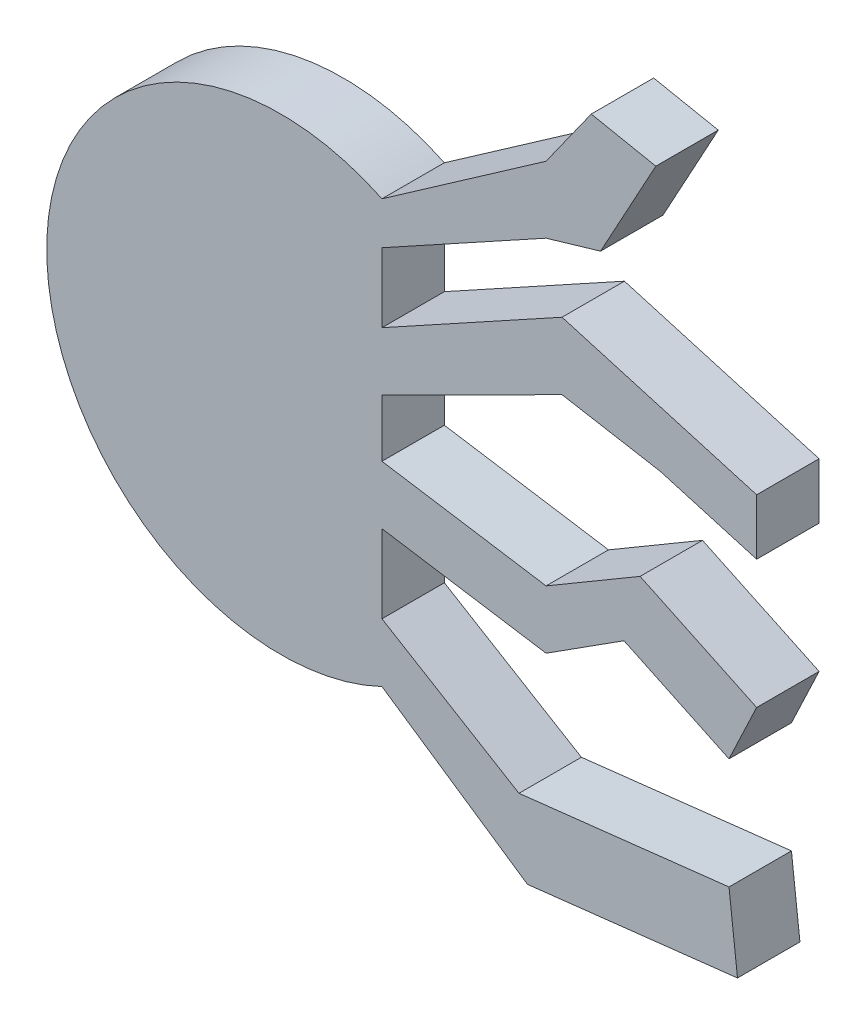
ISO-10303-21;
HEADER;
FILE_DESCRIPTION(('STEP AP214'),'2;1');
FILE_NAME('part.step','',(''),(''),'','','');
FILE_SCHEMA(('AUTOMOTIVE_DESIGN { 1 0 10303 214 1 1 1 1 }'));
ENDSEC;
DATA;
#1=APPLICATION_CONTEXT('core data for automotive mechanical design processes');
#2=APPLICATION_PROTOCOL_DEFINITION('international standard','automotive_design',2000,#1);
#3=PRODUCT_CONTEXT('',#1,'mechanical');
#4=PRODUCT('Part','Part','',(#3));
#5=PRODUCT_RELATED_PRODUCT_CATEGORY('part','',(#4));
#6=PRODUCT_DEFINITION_FORMATION('','',#4);
#7=PRODUCT_DEFINITION_CONTEXT('part definition',#1,'design');
#8=PRODUCT_DEFINITION('design','',#6,#7);
#9=PRODUCT_DEFINITION_SHAPE('','',#8);
#10=(LENGTH_UNIT() NAMED_UNIT(*) SI_UNIT(.MILLI.,.METRE.));
#11=(NAMED_UNIT(*) PLANE_ANGLE_UNIT() SI_UNIT($,.RADIAN.));
#12=(NAMED_UNIT(*) SI_UNIT($,.STERADIAN.) SOLID_ANGLE_UNIT());
#13=UNCERTAINTY_MEASURE_WITH_UNIT(LENGTH_MEASURE(1.E-05),#10,'distance_accuracy_value','');
#14=(GEOMETRIC_REPRESENTATION_CONTEXT(3) GLOBAL_UNCERTAINTY_ASSIGNED_CONTEXT((#13)) GLOBAL_UNIT_ASSIGNED_CONTEXT((#10,
#11,#12)) REPRESENTATION_CONTEXT('',''));
#15=CARTESIAN_POINT('',(0.,0.,0.));
#16=DIRECTION('',(0.,0.,1.));
#17=DIRECTION('',(1.,0.,0.));
#18=AXIS2_PLACEMENT_3D('',#15,#16,#17);
#19=CARTESIAN_POINT('',(0.,0.,6.));
#20=DIRECTION('',(0.,0.,-1.));
#21=DIRECTION('',(-1.,0.,0.));
#22=AXIS2_PLACEMENT_3D('',#19,#20,#21);
#23=CYLINDRICAL_SURFACE('',#22,22.5);
#24=CARTESIAN_POINT('',(0.,0.,0.));
#25=DIRECTION('',(0.,0.,1.));
#26=DIRECTION('',(1.,0.,0.));
#27=AXIS2_PLACEMENT_3D('',#24,#25,#26);
#28=CIRCLE('',#27,22.5);
#29=CARTESIAN_POINT('',(9.71323873703334,20.2953933994243,0.));
#30=VERTEX_POINT('',#29);
#31=CARTESIAN_POINT('',(9.71323873703334,-20.2953933994243,0.));
#32=VERTEX_POINT('',#31);
#33=EDGE_CURVE('E257',#30,#32,#28,.T.);
#34=ORIENTED_EDGE('',*,*,#33,.T.);
#35=DIRECTION('',(0.,0.,-1.));
#36=VECTOR('',#35,1.);
#37=CARTESIAN_POINT('',(9.71323873703334,-20.2953933994243,6.));
#38=LINE('',#37,#36);
#39=CARTESIAN_POINT('',(9.71323873703334,-20.2953933994243,6.));
#40=VERTEX_POINT('',#39);
#41=EDGE_CURVE('E11',#40,#32,#38,.T.);
#42=ORIENTED_EDGE('',*,*,#41,.F.);
#43=CARTESIAN_POINT('',(0.,0.,6.));
#44=DIRECTION('',(0.,0.,1.));
#45=DIRECTION('',(1.,0.,0.));
#46=AXIS2_PLACEMENT_3D('',#43,#44,#45);
#47=CIRCLE('',#46,22.5);
#48=CARTESIAN_POINT('',(9.71323873703334,20.2953933994243,6.));
#49=VERTEX_POINT('',#48);
#50=EDGE_CURVE('E312',#49,#40,#47,.T.);
#51=ORIENTED_EDGE('',*,*,#50,.F.);
#52=DIRECTION('',(0.,0.,-1.));
#53=VECTOR('',#52,1.);
#54=CARTESIAN_POINT('',(9.71323873703334,20.2953933994243,6.));
#55=LINE('',#54,#53);
#56=EDGE_CURVE('E253',#49,#30,#55,.T.);
#57=ORIENTED_EDGE('',*,*,#56,.T.);
#58=EDGE_LOOP('',(#34,#42,#51,#57));
#59=FACE_BOUND('',#58,.T.);
#60=ADVANCED_FACE('F41',(#59),#23,.T.);
#61=CARTESIAN_POINT('',(9.71323873703334,-20.2953933994243,6.));
#62=DIRECTION('',(0.560706931443563,0.828014333831935,0.));
#63=DIRECTION('',(-0.828014333831935,0.560706931443563,0.));
#64=AXIS2_PLACEMENT_3D('',#61,#62,#63);
#65=PLANE('',#64);
#66=DIRECTION('',(0.828014333831935,-0.560706931443563,0.));
#67=VECTOR('',#66,1.);
#68=CARTESIAN_POINT('',(9.71323873703334,-20.2953933994243,0.));
#69=LINE('',#68,#67);
#70=CARTESIAN_POINT('',(23.6966889023651,-29.7645742008144,0.));
#71=VERTEX_POINT('',#70);
#72=EDGE_CURVE('E260',#32,#71,#69,.T.);
#73=ORIENTED_EDGE('',*,*,#72,.T.);
#74=DIRECTION('',(0.,0.,-1.));
#75=VECTOR('',#74,1.);
#76=CARTESIAN_POINT('',(23.6966889023651,-29.7645742008144,6.));
#77=LINE('',#76,#75);
#78=CARTESIAN_POINT('',(23.6966889023651,-29.7645742008144,6.));
#79=VERTEX_POINT('',#78);
#80=EDGE_CURVE('E49',#79,#71,#77,.T.);
#81=ORIENTED_EDGE('',*,*,#80,.F.);
#82=DIRECTION('',(0.828014333831935,-0.560706931443563,0.));
#83=VECTOR('',#82,1.);
#84=CARTESIAN_POINT('',(9.71323873703334,-20.2953933994243,6.));
#85=LINE('',#84,#83);
#86=EDGE_CURVE('E160',#40,#79,#85,.T.);
#87=ORIENTED_EDGE('',*,*,#86,.F.);
#88=ORIENTED_EDGE('',*,*,#41,.T.);
#89=EDGE_LOOP('',(#73,#81,#87,#88));
#90=FACE_BOUND('',#89,.T.);
#91=ADVANCED_FACE('F470',(#90),#65,.F.);
#92=CARTESIAN_POINT('',(23.6966889023651,-29.7645742008144,6.));
#93=DIRECTION('',(-0.113191877530502,0.993573147212182,0.));
#94=DIRECTION('',(-0.993573147212182,-0.113191877530502,0.));
#95=AXIS2_PLACEMENT_3D('',#92,#93,#94);
#96=PLANE('',#95);
#97=DIRECTION('',(0.993573147212182,0.113191877530502,0.));
#98=VECTOR('',#97,1.);
#99=CARTESIAN_POINT('',(23.6966889023651,-29.7645742008144,0.));
#100=LINE('',#99,#98);
#101=CARTESIAN_POINT('',(43.8803915793121,-27.4651650350862,0.));
#102=VERTEX_POINT('',#101);
#103=EDGE_CURVE('E263',#71,#102,#100,.T.);
#104=ORIENTED_EDGE('',*,*,#103,.T.);
#105=DIRECTION('',(0.,0.,-1.));
#106=VECTOR('',#105,1.);
#107=CARTESIAN_POINT('',(43.8803915793121,-27.4651650350862,6.));
#108=LINE('',#107,#106);
#109=CARTESIAN_POINT('',(43.8803915793121,-27.4651650350862,6.));
#110=VERTEX_POINT('',#109);
#111=EDGE_CURVE('E379',#110,#102,#108,.T.);
#112=ORIENTED_EDGE('',*,*,#111,.F.);
#113=DIRECTION('',(0.993573147212182,0.113191877530502,0.));
#114=VECTOR('',#113,1.);
#115=CARTESIAN_POINT('',(23.6966889023651,-29.7645742008144,6.));
#116=LINE('',#115,#114);
#117=EDGE_CURVE('E387',#79,#110,#116,.T.);
#118=ORIENTED_EDGE('',*,*,#117,.F.);
#119=ORIENTED_EDGE('',*,*,#80,.T.);
#120=EDGE_LOOP('',(#104,#112,#118,#119));
#121=FACE_BOUND('',#120,.T.);
#122=ADVANCED_FACE('F385',(#121),#96,.F.);
#123=CARTESIAN_POINT('',(43.8803915793121,-27.4651650350862,6.));
#124=DIRECTION('',(-0.993573147212182,-0.113191877530502,0.));
#125=DIRECTION('',(0.113191877530502,-0.993573147212182,0.));
#126=AXIS2_PLACEMENT_3D('',#123,#124,#125);
#127=PLANE('',#126);
#128=DIRECTION('',(-0.113191877530501,0.993573147212182,0.));
#129=VECTOR('',#128,1.);
#130=CARTESIAN_POINT('',(43.8803915793121,-27.4651650350862,0.));
#131=LINE('',#130,#129);
#132=CARTESIAN_POINT('',(43.0635821524646,-20.2953933994243,0.));
#133=VERTEX_POINT('',#132);
#134=EDGE_CURVE('E265',#102,#133,#131,.T.);
#135=ORIENTED_EDGE('',*,*,#134,.T.);
#136=DIRECTION('',(0.,0.,-1.));
#137=VECTOR('',#136,1.);
#138=CARTESIAN_POINT('',(43.0635821524646,-20.2953933994243,6.));
#139=LINE('',#138,#137);
#140=CARTESIAN_POINT('',(43.0635821524646,-20.2953933994243,6.));
#141=VERTEX_POINT('',#140);
#142=EDGE_CURVE('E376',#141,#133,#139,.T.);
#143=ORIENTED_EDGE('',*,*,#142,.F.);
#144=DIRECTION('',(-0.113191877530501,0.993573147212182,0.));
#145=VECTOR('',#144,1.);
#146=CARTESIAN_POINT('',(43.8803915793121,-27.4651650350862,6.));
#147=LINE('',#146,#145);
#148=EDGE_CURVE('E405',#110,#141,#147,.T.);
#149=ORIENTED_EDGE('',*,*,#148,.F.);
#150=ORIENTED_EDGE('',*,*,#111,.T.);
#151=EDGE_LOOP('',(#135,#143,#149,#150));
#152=FACE_BOUND('',#151,.T.);
#153=ADVANCED_FACE('F396',(#152),#127,.F.);
#154=CARTESIAN_POINT('',(43.0635821524646,-20.2953933994243,6.));
#155=DIRECTION('',(0.113191877530502,-0.993573147212182,0.));
#156=DIRECTION('',(0.993573147212182,0.113191877530502,0.));
#157=AXIS2_PLACEMENT_3D('',#154,#155,#156);
#158=PLANE('',#157);
#159=DIRECTION('',(-0.993573147212182,-0.113191877530502,0.));
#160=VECTOR('',#159,1.);
#161=CARTESIAN_POINT('',(43.0635821524646,-20.2953933994243,0.));
#162=LINE('',#161,#160);
#163=CARTESIAN_POINT('',(22.8798794755175,-22.5948025651524,0.));
#164=VERTEX_POINT('',#163);
#165=EDGE_CURVE('E267',#133,#164,#162,.T.);
#166=ORIENTED_EDGE('',*,*,#165,.T.);
#167=DIRECTION('',(0.,0.,-1.));
#168=VECTOR('',#167,1.);
#169=CARTESIAN_POINT('',(22.8798794755175,-22.5948025651524,6.));
#170=LINE('',#169,#168);
#171=CARTESIAN_POINT('',(22.8798794755175,-22.5948025651524,6.));
#172=VERTEX_POINT('',#171);
#173=EDGE_CURVE('E373',#172,#164,#170,.T.);
#174=ORIENTED_EDGE('',*,*,#173,.F.);
#175=DIRECTION('',(-0.993573147212182,-0.113191877530502,0.));
#176=VECTOR('',#175,1.);
#177=CARTESIAN_POINT('',(43.0635821524646,-20.2953933994243,6.));
#178=LINE('',#177,#176);
#179=EDGE_CURVE('E402',#141,#172,#178,.T.);
#180=ORIENTED_EDGE('',*,*,#179,.F.);
#181=ORIENTED_EDGE('',*,*,#142,.T.);
#182=EDGE_LOOP('',(#166,#174,#180,#181));
#183=FACE_BOUND('',#182,.T.);
#184=ADVANCED_FACE('F400',(#183),#158,.F.);
#185=CARTESIAN_POINT('',(22.8798794755175,-22.5948025651524,6.));
#186=DIRECTION('',(-0.516335030808371,-0.856386674324232,0.));
#187=DIRECTION('',(0.856386674324232,-0.516335030808371,0.));
#188=AXIS2_PLACEMENT_3D('',#185,#186,#187);
#189=PLANE('',#188);
#190=DIRECTION('',(-0.856386674324232,0.516335030808371,0.));
#191=VECTOR('',#190,1.);
#192=CARTESIAN_POINT('',(22.8798794755175,-22.5948025651524,0.));
#193=LINE('',#192,#191);
#194=CARTESIAN_POINT('',(9.71323873703334,-14.6563349836566,0.));
#195=VERTEX_POINT('',#194);
#196=EDGE_CURVE('E269',#164,#195,#193,.T.);
#197=ORIENTED_EDGE('',*,*,#196,.T.);
#198=DIRECTION('',(0.,0.,-1.));
#199=VECTOR('',#198,1.);
#200=CARTESIAN_POINT('',(9.71323873703334,-14.6563349836566,6.));
#201=LINE('',#200,#199);
#202=CARTESIAN_POINT('',(9.71323873703334,-14.6563349836566,6.));
#203=VERTEX_POINT('',#202);
#204=EDGE_CURVE('E370',#203,#195,#201,.T.);
#205=ORIENTED_EDGE('',*,*,#204,.F.);
#206=DIRECTION('',(-0.856386674324232,0.516335030808371,0.));
#207=VECTOR('',#206,1.);
#208=CARTESIAN_POINT('',(22.8798794755175,-22.5948025651524,6.));
#209=LINE('',#208,#207);
#210=EDGE_CURVE('E404',#172,#203,#209,.T.);
#211=ORIENTED_EDGE('',*,*,#210,.F.);
#212=ORIENTED_EDGE('',*,*,#173,.T.);
#213=EDGE_LOOP('',(#197,#205,#211,#212));
#214=FACE_BOUND('',#213,.T.);
#215=ADVANCED_FACE('F483',(#214),#189,.F.);
#216=CARTESIAN_POINT('',(9.71323873703334,-7.15371740448759,6.));
#217=DIRECTION('',(-1.,0.,0.));
#218=DIRECTION('',(0.,0.,1.));
#219=AXIS2_PLACEMENT_3D('',#216,#217,#218);
#220=PLANE('',#219);
#221=DIRECTION('',(0.,1.,0.));
#222=VECTOR('',#221,1.);
#223=CARTESIAN_POINT('',(9.71323873703334,-7.15371740448759,0.));
#224=LINE('',#223,#222);
#225=CARTESIAN_POINT('',(9.71323873703334,-7.15371740448759,0.));
#226=VERTEX_POINT('',#225);
#227=EDGE_CURVE('E271',#195,#226,#224,.T.);
#228=ORIENTED_EDGE('',*,*,#227,.T.);
#229=DIRECTION('',(0.,0.,-1.));
#230=VECTOR('',#229,1.);
#231=CARTESIAN_POINT('',(9.71323873703334,-7.15371740448759,6.));
#232=LINE('',#231,#230);
#233=CARTESIAN_POINT('',(9.71323873703334,-7.15371740448759,6.));
#234=VERTEX_POINT('',#233);
#235=EDGE_CURVE('E367',#234,#226,#232,.T.);
#236=ORIENTED_EDGE('',*,*,#235,.F.);
#237=DIRECTION('',(0.,1.,0.));
#238=VECTOR('',#237,1.);
#239=CARTESIAN_POINT('',(9.71323873703334,-7.15371740448759,6.));
#240=LINE('',#239,#238);
#241=EDGE_CURVE('E407',#203,#234,#240,.T.);
#242=ORIENTED_EDGE('',*,*,#241,.F.);
#243=ORIENTED_EDGE('',*,*,#204,.T.);
#244=EDGE_LOOP('',(#228,#236,#242,#243));
#245=FACE_BOUND('',#244,.T.);
#246=ADVANCED_FACE('F486',(#245),#220,.F.);
#247=CARTESIAN_POINT('',(9.71323873703334,-7.15371740448759,6.));
#248=DIRECTION('',(0.15556619244721,0.987825470296994,0.));
#249=DIRECTION('',(-0.987825470296994,0.15556619244721,0.));
#250=AXIS2_PLACEMENT_3D('',#247,#248,#249);
#251=PLANE('',#250);
#252=DIRECTION('',(0.987825470296994,-0.15556619244721,0.));
#253=VECTOR('',#252,1.);
#254=CARTESIAN_POINT('',(9.71323873703334,-7.15371740448759,0.));
#255=LINE('',#254,#253);
#256=CARTESIAN_POINT('',(25.485118253487,-9.63752787292303,0.));
#257=VERTEX_POINT('',#256);
#258=EDGE_CURVE('E273',#226,#257,#255,.T.);
#259=ORIENTED_EDGE('',*,*,#258,.T.);
#260=DIRECTION('',(0.,0.,-1.));
#261=VECTOR('',#260,1.);
#262=CARTESIAN_POINT('',(25.485118253487,-9.63752787292303,6.));
#263=LINE('',#262,#261);
#264=CARTESIAN_POINT('',(25.485118253487,-9.63752787292303,6.));
#265=VERTEX_POINT('',#264);
#266=EDGE_CURVE('E364',#265,#257,#263,.T.);
#267=ORIENTED_EDGE('',*,*,#266,.F.);
#268=DIRECTION('',(0.987825470296994,-0.15556619244721,0.));
#269=VECTOR('',#268,1.);
#270=CARTESIAN_POINT('',(9.71323873703334,-7.15371740448759,6.));
#271=LINE('',#270,#269);
#272=EDGE_CURVE('E413',#234,#265,#271,.T.);
#273=ORIENTED_EDGE('',*,*,#272,.F.);
#274=ORIENTED_EDGE('',*,*,#235,.T.);
#275=EDGE_LOOP('',(#259,#267,#273,#274));
#276=FACE_BOUND('',#275,.T.);
#277=ADVANCED_FACE('F490',(#276),#251,.F.);
#278=CARTESIAN_POINT('',(25.485118253487,-9.63752787292303,6.));
#279=DIRECTION('',(-0.538397754255914,0.84269084379278,0.));
#280=DIRECTION('',(-0.842690843792781,-0.538397754255914,0.));
#281=AXIS2_PLACEMENT_3D('',#278,#279,#280);
#282=PLANE('',#281);
#283=DIRECTION('',(0.84269084379278,0.538397754255914,0.));
#284=VECTOR('',#283,1.);
#285=CARTESIAN_POINT('',(25.485118253487,-9.63752787292303,0.));
#286=LINE('',#285,#284);
#287=CARTESIAN_POINT('',(32.971730813991,-4.85430823875943,0.));
#288=VERTEX_POINT('',#287);
#289=EDGE_CURVE('E275',#257,#288,#286,.T.);
#290=ORIENTED_EDGE('',*,*,#289,.T.);
#291=DIRECTION('',(0.,0.,-1.));
#292=VECTOR('',#291,1.);
#293=CARTESIAN_POINT('',(32.971730813991,-4.85430823875943,6.));
#294=LINE('',#293,#292);
#295=CARTESIAN_POINT('',(32.971730813991,-4.85430823875943,6.));
#296=VERTEX_POINT('',#295);
#297=EDGE_CURVE('E361',#296,#288,#294,.T.);
#298=ORIENTED_EDGE('',*,*,#297,.F.);
#299=DIRECTION('',(0.84269084379278,0.538397754255914,0.));
#300=VECTOR('',#299,1.);
#301=CARTESIAN_POINT('',(25.485118253487,-9.63752787292303,6.));
#302=LINE('',#301,#300);
#303=EDGE_CURVE('E415',#265,#296,#302,.T.);
#304=ORIENTED_EDGE('',*,*,#303,.F.);
#305=ORIENTED_EDGE('',*,*,#266,.T.);
#306=EDGE_LOOP('',(#290,#298,#304,#305));
#307=FACE_BOUND('',#306,.T.);
#308=ADVANCED_FACE('F494',(#307),#282,.F.);
#309=CARTESIAN_POINT('',(32.971730813991,-4.85430823875943,6.));
#310=DIRECTION('',(0.428296149562964,0.903638427840217,0.));
#311=DIRECTION('',(-0.903638427840217,0.428296149562964,0.));
#312=AXIS2_PLACEMENT_3D('',#309,#310,#311);
#313=PLANE('',#312);
#314=DIRECTION('',(0.903638427840217,-0.428296149562963,0.));
#315=VECTOR('',#314,1.);
#316=CARTESIAN_POINT('',(32.971730813991,-4.85430823875943,0.));
#317=LINE('',#316,#315);
#318=CARTESIAN_POINT('',(43.0635821524646,-9.63752787292303,0.));
#319=VERTEX_POINT('',#318);
#320=EDGE_CURVE('E277',#288,#319,#317,.T.);
#321=ORIENTED_EDGE('',*,*,#320,.T.);
#322=DIRECTION('',(0.,0.,-1.));
#323=VECTOR('',#322,1.);
#324=CARTESIAN_POINT('',(43.0635821524646,-9.63752787292303,6.));
#325=LINE('',#324,#323);
#326=CARTESIAN_POINT('',(43.0635821524646,-9.63752787292303,6.));
#327=VERTEX_POINT('',#326);
#328=EDGE_CURVE('E358',#327,#319,#325,.T.);
#329=ORIENTED_EDGE('',*,*,#328,.F.);
#330=DIRECTION('',(0.903638427840217,-0.428296149562963,0.));
#331=VECTOR('',#330,1.);
#332=CARTESIAN_POINT('',(32.971730813991,-4.85430823875943,6.));
#333=LINE('',#332,#331);
#334=EDGE_CURVE('E417',#296,#327,#333,.T.);
#335=ORIENTED_EDGE('',*,*,#334,.F.);
#336=ORIENTED_EDGE('',*,*,#297,.T.);
#337=EDGE_LOOP('',(#321,#329,#335,#336));
#338=FACE_BOUND('',#337,.T.);
#339=ADVANCED_FACE('F498',(#338),#313,.F.);
#340=CARTESIAN_POINT('',(43.0635821524646,-9.63752787292303,6.));
#341=DIRECTION('',(-0.903638427840217,0.428296149562964,0.));
#342=DIRECTION('',(-0.428296149562964,-0.903638427840217,0.));
#343=AXIS2_PLACEMENT_3D('',#340,#341,#342);
#344=PLANE('',#343);
#345=DIRECTION('',(0.428296149562964,0.903638427840217,0.));
#346=VECTOR('',#345,1.);
#347=CARTESIAN_POINT('',(43.0635821524646,-9.63752787292303,0.));
#348=LINE('',#347,#346);
#349=CARTESIAN_POINT('',(45.7205039064935,-4.03183517838196,0.));
#350=VERTEX_POINT('',#349);
#351=EDGE_CURVE('E279',#319,#350,#348,.T.);
#352=ORIENTED_EDGE('',*,*,#351,.T.);
#353=DIRECTION('',(0.,0.,-1.));
#354=VECTOR('',#353,1.);
#355=CARTESIAN_POINT('',(45.7205039064935,-4.03183517838196,6.));
#356=LINE('',#355,#354);
#357=CARTESIAN_POINT('',(45.7205039064935,-4.03183517838196,6.));
#358=VERTEX_POINT('',#357);
#359=EDGE_CURVE('E355',#358,#350,#356,.T.);
#360=ORIENTED_EDGE('',*,*,#359,.F.);
#361=DIRECTION('',(0.428296149562964,0.903638427840217,0.));
#362=VECTOR('',#361,1.);
#363=CARTESIAN_POINT('',(43.0635821524646,-9.63752787292303,6.));
#364=LINE('',#363,#362);
#365=EDGE_CURVE('E419',#327,#358,#364,.T.);
#366=ORIENTED_EDGE('',*,*,#365,.F.);
#367=ORIENTED_EDGE('',*,*,#328,.T.);
#368=EDGE_LOOP('',(#352,#360,#366,#367));
#369=FACE_BOUND('',#368,.T.);
#370=ADVANCED_FACE('F502',(#369),#344,.F.);
#371=CARTESIAN_POINT('',(45.7205039064935,-4.03183517838196,6.));
#372=DIRECTION('',(-0.428296149562964,-0.903638427840217,0.));
#373=DIRECTION('',(0.903638427840217,-0.428296149562964,0.));
#374=AXIS2_PLACEMENT_3D('',#371,#372,#373);
#375=PLANE('',#374);
#376=DIRECTION('',(-0.903638427840217,0.428296149562964,0.));
#377=VECTOR('',#376,1.);
#378=CARTESIAN_POINT('',(45.7205039064935,-4.03183517838196,0.));
#379=LINE('',#378,#377);
#380=CARTESIAN_POINT('',(34.5193775826407,1.27714585592482,0.));
#381=VERTEX_POINT('',#380);
#382=EDGE_CURVE('E281',#350,#381,#379,.T.);
#383=ORIENTED_EDGE('',*,*,#382,.T.);
#384=DIRECTION('',(0.,0.,-1.));
#385=VECTOR('',#384,1.);
#386=CARTESIAN_POINT('',(34.5193775826407,1.27714585592482,6.));
#387=LINE('',#386,#385);
#388=CARTESIAN_POINT('',(34.5193775826407,1.27714585592482,6.));
#389=VERTEX_POINT('',#388);
#390=EDGE_CURVE('E352',#389,#381,#387,.T.);
#391=ORIENTED_EDGE('',*,*,#390,.F.);
#392=DIRECTION('',(-0.903638427840217,0.428296149562964,0.));
#393=VECTOR('',#392,1.);
#394=CARTESIAN_POINT('',(45.7205039064935,-4.03183517838196,6.));
#395=LINE('',#394,#393);
#396=EDGE_CURVE('E421',#358,#389,#395,.T.);
#397=ORIENTED_EDGE('',*,*,#396,.F.);
#398=ORIENTED_EDGE('',*,*,#359,.T.);
#399=EDGE_LOOP('',(#383,#391,#397,#398));
#400=FACE_BOUND('',#399,.T.);
#401=ADVANCED_FACE('F506',(#400),#375,.F.);
#402=CARTESIAN_POINT('',(34.5193775826407,1.27714585592482,6.));
#403=DIRECTION('',(0.506645081791365,-0.862154719929446,0.));
#404=DIRECTION('',(0.862154719929446,0.506645081791365,0.));
#405=AXIS2_PLACEMENT_3D('',#402,#403,#404);
#406=PLANE('',#405);
#407=DIRECTION('',(-0.862154719929446,-0.506645081791365,0.));
#408=VECTOR('',#407,1.);
#409=CARTESIAN_POINT('',(34.5193775826407,1.27714585592482,0.));
#410=LINE('',#409,#408);
#411=CARTESIAN_POINT('',(25.485118253487,-4.03183517838196,0.));
#412=VERTEX_POINT('',#411);
#413=EDGE_CURVE('E283',#381,#412,#410,.T.);
#414=ORIENTED_EDGE('',*,*,#413,.T.);
#415=DIRECTION('',(0.,0.,-1.));
#416=VECTOR('',#415,1.);
#417=CARTESIAN_POINT('',(25.485118253487,-4.03183517838196,6.));
#418=LINE('',#417,#416);
#419=CARTESIAN_POINT('',(25.485118253487,-4.03183517838196,6.));
#420=VERTEX_POINT('',#419);
#421=EDGE_CURVE('E349',#420,#412,#418,.T.);
#422=ORIENTED_EDGE('',*,*,#421,.F.);
#423=DIRECTION('',(-0.862154719929446,-0.506645081791365,0.));
#424=VECTOR('',#423,1.);
#425=CARTESIAN_POINT('',(34.5193775826407,1.27714585592482,6.));
#426=LINE('',#425,#424);
#427=EDGE_CURVE('E423',#389,#420,#426,.T.);
#428=ORIENTED_EDGE('',*,*,#427,.F.);
#429=ORIENTED_EDGE('',*,*,#390,.T.);
#430=EDGE_LOOP('',(#414,#422,#428,#429));
#431=FACE_BOUND('',#430,.T.);
#432=ADVANCED_FACE('F510',(#431),#406,.F.);
#433=CARTESIAN_POINT('',(25.485118253487,-4.03183517838196,6.));
#434=DIRECTION('',(-0.15556619244721,-0.987825470296994,0.));
#435=DIRECTION('',(0.987825470296994,-0.15556619244721,0.));
#436=AXIS2_PLACEMENT_3D('',#433,#434,#435);
#437=PLANE('',#436);
#438=DIRECTION('',(-0.987825470296994,0.15556619244721,0.));
#439=VECTOR('',#438,1.);
#440=CARTESIAN_POINT('',(25.485118253487,-4.03183517838196,0.));
#441=LINE('',#440,#439);
#442=CARTESIAN_POINT('',(9.71323873703334,-1.54802470994652,0.));
#443=VERTEX_POINT('',#442);
#444=EDGE_CURVE('E285',#412,#443,#441,.T.);
#445=ORIENTED_EDGE('',*,*,#444,.T.);
#446=DIRECTION('',(0.,0.,-1.));
#447=VECTOR('',#446,1.);
#448=CARTESIAN_POINT('',(9.71323873703334,-1.54802470994652,6.));
#449=LINE('',#448,#447);
#450=CARTESIAN_POINT('',(9.71323873703334,-1.54802470994652,6.));
#451=VERTEX_POINT('',#450);
#452=EDGE_CURVE('E346',#451,#443,#449,.T.);
#453=ORIENTED_EDGE('',*,*,#452,.F.);
#454=DIRECTION('',(-0.987825470296994,0.15556619244721,0.));
#455=VECTOR('',#454,1.);
#456=CARTESIAN_POINT('',(25.485118253487,-4.03183517838196,6.));
#457=LINE('',#456,#455);
#458=EDGE_CURVE('E425',#420,#451,#457,.T.);
#459=ORIENTED_EDGE('',*,*,#458,.F.);
#460=ORIENTED_EDGE('',*,*,#421,.T.);
#461=EDGE_LOOP('',(#445,#453,#459,#460));
#462=FACE_BOUND('',#461,.T.);
#463=ADVANCED_FACE('F514',(#462),#437,.F.);
#464=CARTESIAN_POINT('',(9.71323873703334,3.96009356319846,6.));
#465=DIRECTION('',(-1.,0.,0.));
#466=DIRECTION('',(0.,0.,1.));
#467=AXIS2_PLACEMENT_3D('',#464,#465,#466);
#468=PLANE('',#467);
#469=DIRECTION('',(0.,1.,0.));
#470=VECTOR('',#469,1.);
#471=CARTESIAN_POINT('',(9.71323873703334,3.96009356319846,0.));
#472=LINE('',#471,#470);
#473=CARTESIAN_POINT('',(9.71323873703334,3.96009356319846,0.));
#474=VERTEX_POINT('',#473);
#475=EDGE_CURVE('E287',#443,#474,#472,.T.);
#476=ORIENTED_EDGE('',*,*,#475,.T.);
#477=DIRECTION('',(0.,0.,-1.));
#478=VECTOR('',#477,1.);
#479=CARTESIAN_POINT('',(9.71323873703334,3.96009356319846,6.));
#480=LINE('',#479,#478);
#481=CARTESIAN_POINT('',(9.71323873703334,3.96009356319846,6.));
#482=VERTEX_POINT('',#481);
#483=EDGE_CURVE('E343',#482,#474,#480,.T.);
#484=ORIENTED_EDGE('',*,*,#483,.F.);
#485=DIRECTION('',(0.,1.,0.));
#486=VECTOR('',#485,1.);
#487=CARTESIAN_POINT('',(9.71323873703334,3.96009356319846,6.));
#488=LINE('',#487,#486);
#489=EDGE_CURVE('E427',#451,#482,#488,.T.);
#490=ORIENTED_EDGE('',*,*,#489,.F.);
#491=ORIENTED_EDGE('',*,*,#452,.T.);
#492=EDGE_LOOP('',(#476,#484,#490,#491));
#493=FACE_BOUND('',#492,.T.);
#494=ADVANCED_FACE('F518',(#493),#468,.F.);
#495=CARTESIAN_POINT('',(9.71323873703334,3.96009356319846,6.));
#496=DIRECTION('',(-0.448628017879463,0.893718580747622,0.));
#497=DIRECTION('',(-0.893718580747623,-0.448628017879463,0.));
#498=AXIS2_PLACEMENT_3D('',#495,#496,#497);
#499=PLANE('',#498);
#500=DIRECTION('',(0.893718580747622,0.448628017879463,0.));
#501=VECTOR('',#500,1.);
#502=CARTESIAN_POINT('',(9.71323873703334,3.96009356319846,0.));
#503=LINE('',#502,#501);
#504=CARTESIAN_POINT('',(27.0180576973057,12.6467504115048,0.));
#505=VERTEX_POINT('',#504);
#506=EDGE_CURVE('E289',#474,#505,#503,.T.);
#507=ORIENTED_EDGE('',*,*,#506,.T.);
#508=DIRECTION('',(0.,0.,-1.));
#509=VECTOR('',#508,1.);
#510=CARTESIAN_POINT('',(27.0180576973057,12.6467504115048,6.));
#511=LINE('',#510,#509);
#512=CARTESIAN_POINT('',(27.0180576973057,12.6467504115048,6.));
#513=VERTEX_POINT('',#512);
#514=EDGE_CURVE('E340',#513,#505,#511,.T.);
#515=ORIENTED_EDGE('',*,*,#514,.F.);
#516=DIRECTION('',(0.893718580747622,0.448628017879463,0.));
#517=VECTOR('',#516,1.);
#518=CARTESIAN_POINT('',(9.71323873703334,3.96009356319846,6.));
#519=LINE('',#518,#517);
#520=EDGE_CURVE('E429',#482,#513,#519,.T.);
#521=ORIENTED_EDGE('',*,*,#520,.F.);
#522=ORIENTED_EDGE('',*,*,#483,.T.);
#523=EDGE_LOOP('',(#507,#515,#521,#522));
#524=FACE_BOUND('',#523,.T.);
#525=ADVANCED_FACE('F522',(#524),#499,.F.);
#526=CARTESIAN_POINT('',(27.0180576973057,12.6467504115048,6.));
#527=DIRECTION('',(0.17302600448638,0.984917256307087,0.));
#528=DIRECTION('',(-0.984917256307087,0.17302600448638,0.));
#529=AXIS2_PLACEMENT_3D('',#526,#527,#528);
#530=PLANE('',#529);
#531=DIRECTION('',(0.984917256307086,-0.17302600448638,0.));
#532=VECTOR('',#531,1.);
#533=CARTESIAN_POINT('',(27.0180576973057,12.6467504115048,0.));
#534=LINE('',#533,#532);
#535=CARTESIAN_POINT('',(36.4711842675214,10.9860660140345,0.));
#536=VERTEX_POINT('',#535);
#537=EDGE_CURVE('E291',#505,#536,#534,.T.);
#538=ORIENTED_EDGE('',*,*,#537,.T.);
#539=DIRECTION('',(0.,0.,-1.));
#540=VECTOR('',#539,1.);
#541=CARTESIAN_POINT('',(36.4711842675214,10.9860660140345,6.));
#542=LINE('',#541,#540);
#543=CARTESIAN_POINT('',(36.4711842675214,10.9860660140345,6.));
#544=VERTEX_POINT('',#543);
#545=EDGE_CURVE('E337',#544,#536,#542,.T.);
#546=ORIENTED_EDGE('',*,*,#545,.F.);
#547=DIRECTION('',(0.984917256307086,-0.17302600448638,0.));
#548=VECTOR('',#547,1.);
#549=CARTESIAN_POINT('',(27.0180576973057,12.6467504115048,6.));
#550=LINE('',#549,#548);
#551=EDGE_CURVE('E431',#513,#544,#550,.T.);
#552=ORIENTED_EDGE('',*,*,#551,.F.);
#553=ORIENTED_EDGE('',*,*,#514,.T.);
#554=EDGE_LOOP('',(#538,#546,#552,#553));
#555=FACE_BOUND('',#554,.T.);
#556=ADVANCED_FACE('F526',(#555),#530,.F.);
#557=CARTESIAN_POINT('',(36.4711842675214,10.9860660140345,6.));
#558=DIRECTION('',(0.27855714333673,0.960419657179131,0.));
#559=DIRECTION('',(-0.960419657179131,0.27855714333673,0.));
#560=AXIS2_PLACEMENT_3D('',#557,#558,#559);
#561=PLANE('',#560);
#562=DIRECTION('',(0.960419657179131,-0.27855714333673,0.));
#563=VECTOR('',#562,1.);
#564=CARTESIAN_POINT('',(36.4711842675214,10.9860660140345,0.));
#565=LINE('',#564,#563);
#566=CARTESIAN_POINT('',(45.7205039064935,8.30342198735162,0.));
#567=VERTEX_POINT('',#566);
#568=EDGE_CURVE('E293',#536,#567,#565,.T.);
#569=ORIENTED_EDGE('',*,*,#568,.T.);
#570=DIRECTION('',(0.,0.,-1.));
#571=VECTOR('',#570,1.);
#572=CARTESIAN_POINT('',(45.7205039064935,8.30342198735162,6.));
#573=LINE('',#572,#571);
#574=CARTESIAN_POINT('',(45.7205039064935,8.30342198735162,6.));
#575=VERTEX_POINT('',#574);
#576=EDGE_CURVE('E334',#575,#567,#573,.T.);
#577=ORIENTED_EDGE('',*,*,#576,.F.);
#578=DIRECTION('',(0.960419657179131,-0.27855714333673,0.));
#579=VECTOR('',#578,1.);
#580=CARTESIAN_POINT('',(36.4711842675214,10.9860660140345,6.));
#581=LINE('',#580,#579);
#582=EDGE_CURVE('E433',#544,#575,#581,.T.);
#583=ORIENTED_EDGE('',*,*,#582,.F.);
#584=ORIENTED_EDGE('',*,*,#545,.T.);
#585=EDGE_LOOP('',(#569,#577,#583,#584));
#586=FACE_BOUND('',#585,.T.);
#587=ADVANCED_FACE('F530',(#586),#561,.F.);
#588=CARTESIAN_POINT('',(45.7205039064935,8.30342198735162,6.));
#589=DIRECTION('',(-1.,0.,0.));
#590=DIRECTION('',(0.,0.,1.));
#591=AXIS2_PLACEMENT_3D('',#588,#589,#590);
#592=PLANE('',#591);
#593=DIRECTION('',(0.,1.,0.));
#594=VECTOR('',#593,1.);
#595=CARTESIAN_POINT('',(45.7205039064935,8.30342198735162,0.));
#596=LINE('',#595,#594);
#597=CARTESIAN_POINT('',(45.7205039064935,13.6687100407173,0.));
#598=VERTEX_POINT('',#597);
#599=EDGE_CURVE('E295',#567,#598,#596,.T.);
#600=ORIENTED_EDGE('',*,*,#599,.T.);
#601=DIRECTION('',(0.,0.,-1.));
#602=VECTOR('',#601,1.);
#603=CARTESIAN_POINT('',(45.7205039064935,13.6687100407173,6.));
#604=LINE('',#603,#602);
#605=CARTESIAN_POINT('',(45.7205039064935,13.6687100407173,6.));
#606=VERTEX_POINT('',#605);
#607=EDGE_CURVE('E331',#606,#598,#604,.T.);
#608=ORIENTED_EDGE('',*,*,#607,.F.);
#609=DIRECTION('',(0.,1.,0.));
#610=VECTOR('',#609,1.);
#611=CARTESIAN_POINT('',(45.7205039064935,8.30342198735162,6.));
#612=LINE('',#611,#610);
#613=EDGE_CURVE('E435',#575,#606,#612,.T.);
#614=ORIENTED_EDGE('',*,*,#613,.F.);
#615=ORIENTED_EDGE('',*,*,#576,.T.);
#616=EDGE_LOOP('',(#600,#608,#614,#615));
#617=FACE_BOUND('',#616,.T.);
#618=ADVANCED_FACE('F534',(#617),#592,.F.);
#619=CARTESIAN_POINT('',(45.7205039064935,13.6687100407173,6.));
#620=DIRECTION('',(-0.27855714333673,-0.960419657179131,0.));
#621=DIRECTION('',(0.960419657179131,-0.27855714333673,0.));
#622=AXIS2_PLACEMENT_3D('',#619,#620,#621);
#623=PLANE('',#622);
#624=DIRECTION('',(-0.960419657179131,0.27855714333673,0.));
#625=VECTOR('',#624,1.);
#626=CARTESIAN_POINT('',(45.7205039064935,13.6687100407173,0.));
#627=LINE('',#626,#625);
#628=CARTESIAN_POINT('',(27.0180576973057,19.0931096253132,0.));
#629=VERTEX_POINT('',#628);
#630=EDGE_CURVE('E297',#598,#629,#627,.T.);
#631=ORIENTED_EDGE('',*,*,#630,.T.);
#632=DIRECTION('',(0.,0.,-1.));
#633=VECTOR('',#632,1.);
#634=CARTESIAN_POINT('',(27.0180576973057,19.0931096253132,6.));
#635=LINE('',#634,#633);
#636=CARTESIAN_POINT('',(27.0180576973057,19.0931096253132,6.));
#637=VERTEX_POINT('',#636);
#638=EDGE_CURVE('E328',#637,#629,#635,.T.);
#639=ORIENTED_EDGE('',*,*,#638,.F.);
#640=DIRECTION('',(-0.960419657179131,0.27855714333673,0.));
#641=VECTOR('',#640,1.);
#642=CARTESIAN_POINT('',(45.7205039064935,13.6687100407173,6.));
#643=LINE('',#642,#641);
#644=EDGE_CURVE('E437',#606,#637,#643,.T.);
#645=ORIENTED_EDGE('',*,*,#644,.F.);
#646=ORIENTED_EDGE('',*,*,#607,.T.);
#647=EDGE_LOOP('',(#631,#639,#645,#646));
#648=FACE_BOUND('',#647,.T.);
#649=ADVANCED_FACE('F538',(#648),#623,.F.);
#650=CARTESIAN_POINT('',(27.0180576973057,19.0931096253132,6.));
#651=DIRECTION('',(0.48214960737487,-0.876088897377577,0.));
#652=DIRECTION('',(0.876088897377577,0.48214960737487,0.));
#653=AXIS2_PLACEMENT_3D('',#650,#651,#652);
#654=PLANE('',#653);
#655=DIRECTION('',(-0.876088897377577,-0.48214960737487,0.));
#656=VECTOR('',#655,1.);
#657=CARTESIAN_POINT('',(27.0180576973057,19.0931096253132,0.));
#658=LINE('',#657,#656);
#659=CARTESIAN_POINT('',(9.71323873703334,9.56951939107623,0.));
#660=VERTEX_POINT('',#659);
#661=EDGE_CURVE('E299',#629,#660,#658,.T.);
#662=ORIENTED_EDGE('',*,*,#661,.T.);
#663=DIRECTION('',(0.,0.,-1.));
#664=VECTOR('',#663,1.);
#665=CARTESIAN_POINT('',(9.71323873703334,9.56951939107623,6.));
#666=LINE('',#665,#664);
#667=CARTESIAN_POINT('',(9.71323873703334,9.56951939107623,6.));
#668=VERTEX_POINT('',#667);
#669=EDGE_CURVE('E325',#668,#660,#666,.T.);
#670=ORIENTED_EDGE('',*,*,#669,.F.);
#671=DIRECTION('',(-0.876088897377577,-0.48214960737487,0.));
#672=VECTOR('',#671,1.);
#673=CARTESIAN_POINT('',(27.0180576973057,19.0931096253132,6.));
#674=LINE('',#673,#672);
#675=EDGE_CURVE('E439',#637,#668,#674,.T.);
#676=ORIENTED_EDGE('',*,*,#675,.F.);
#677=ORIENTED_EDGE('',*,*,#638,.T.);
#678=EDGE_LOOP('',(#662,#670,#676,#677));
#679=FACE_BOUND('',#678,.T.);
#680=ADVANCED_FACE('F542',(#679),#654,.F.);
#681=CARTESIAN_POINT('',(9.71323873703334,16.2236091137486,6.));
#682=DIRECTION('',(-1.,0.,0.));
#683=DIRECTION('',(0.,0.,1.));
#684=AXIS2_PLACEMENT_3D('',#681,#682,#683);
#685=PLANE('',#684);
#686=DIRECTION('',(0.,1.,0.));
#687=VECTOR('',#686,1.);
#688=CARTESIAN_POINT('',(9.71323873703334,16.2236091137486,0.));
#689=LINE('',#688,#687);
#690=CARTESIAN_POINT('',(9.71323873703334,16.2236091137486,0.));
#691=VERTEX_POINT('',#690);
#692=EDGE_CURVE('E301',#660,#691,#689,.T.);
#693=ORIENTED_EDGE('',*,*,#692,.T.);
#694=DIRECTION('',(0.,0.,-1.));
#695=VECTOR('',#694,1.);
#696=CARTESIAN_POINT('',(9.71323873703334,16.2236091137486,6.));
#697=LINE('',#696,#695);
#698=CARTESIAN_POINT('',(9.71323873703334,16.2236091137486,6.));
#699=VERTEX_POINT('',#698);
#700=EDGE_CURVE('E322',#699,#691,#697,.T.);
#701=ORIENTED_EDGE('',*,*,#700,.F.);
#702=DIRECTION('',(0.,1.,0.));
#703=VECTOR('',#702,1.);
#704=CARTESIAN_POINT('',(9.71323873703334,16.2236091137486,6.));
#705=LINE('',#704,#703);
#706=EDGE_CURVE('E441',#668,#699,#705,.T.);
#707=ORIENTED_EDGE('',*,*,#706,.F.);
#708=ORIENTED_EDGE('',*,*,#669,.T.);
#709=EDGE_LOOP('',(#693,#701,#707,#708));
#710=FACE_BOUND('',#709,.T.);
#711=ADVANCED_FACE('F546',(#710),#685,.F.);
#712=CARTESIAN_POINT('',(9.71323873703334,16.2236091137486,6.));
#713=DIRECTION('',(-0.48214960737487,0.876088897377577,0.));
#714=DIRECTION('',(-0.876088897377577,-0.48214960737487,0.));
#715=AXIS2_PLACEMENT_3D('',#712,#713,#714);
#716=PLANE('',#715);
#717=DIRECTION('',(0.876088897377577,0.48214960737487,0.));
#718=VECTOR('',#717,1.);
#719=CARTESIAN_POINT('',(9.71323873703334,16.2236091137486,0.));
#720=LINE('',#719,#718);
#721=CARTESIAN_POINT('',(25.485118253487,24.9035564788897,0.));
#722=VERTEX_POINT('',#721);
#723=EDGE_CURVE('E303',#691,#722,#720,.T.);
#724=ORIENTED_EDGE('',*,*,#723,.T.);
#725=DIRECTION('',(0.,0.,-1.));
#726=VECTOR('',#725,1.);
#727=CARTESIAN_POINT('',(25.485118253487,24.9035564788897,6.));
#728=LINE('',#727,#726);
#729=CARTESIAN_POINT('',(25.485118253487,24.9035564788897,6.));
#730=VERTEX_POINT('',#729);
#731=EDGE_CURVE('E319',#730,#722,#728,.T.);
#732=ORIENTED_EDGE('',*,*,#731,.F.);
#733=DIRECTION('',(0.876088897377577,0.48214960737487,0.));
#734=VECTOR('',#733,1.);
#735=CARTESIAN_POINT('',(9.71323873703334,16.2236091137486,6.));
#736=LINE('',#735,#734);
#737=EDGE_CURVE('E443',#699,#730,#736,.T.);
#738=ORIENTED_EDGE('',*,*,#737,.F.);
#739=ORIENTED_EDGE('',*,*,#700,.T.);
#740=EDGE_LOOP('',(#724,#732,#738,#739));
#741=FACE_BOUND('',#740,.T.);
#742=ADVANCED_FACE('F550',(#741),#716,.F.);
#743=CARTESIAN_POINT('',(25.485118253487,24.9035564788897,6.));
#744=DIRECTION('',(-0.282030615298706,0.95940540546436,0.));
#745=DIRECTION('',(-0.95940540546436,-0.282030615298706,0.));
#746=AXIS2_PLACEMENT_3D('',#743,#744,#745);
#747=PLANE('',#746);
#748=DIRECTION('',(0.95940540546436,0.282030615298706,0.));
#749=VECTOR('',#748,1.);
#750=CARTESIAN_POINT('',(25.485118253487,24.9035564788897,0.));
#751=LINE('',#750,#749);
#752=CARTESIAN_POINT('',(30.7226613532011,26.4432054058737,0.));
#753=VERTEX_POINT('',#752);
#754=EDGE_CURVE('E305',#722,#753,#751,.T.);
#755=ORIENTED_EDGE('',*,*,#754,.T.);
#756=DIRECTION('',(0.,0.,-1.));
#757=VECTOR('',#756,1.);
#758=CARTESIAN_POINT('',(30.7226613532011,26.4432054058737,6.));
#759=LINE('',#758,#757);
#760=CARTESIAN_POINT('',(30.7226613532011,26.4432054058737,6.));
#761=VERTEX_POINT('',#760);
#762=EDGE_CURVE('E316',#761,#753,#759,.T.);
#763=ORIENTED_EDGE('',*,*,#762,.F.);
#764=DIRECTION('',(0.95940540546436,0.282030615298706,0.));
#765=VECTOR('',#764,1.);
#766=CARTESIAN_POINT('',(25.485118253487,24.9035564788897,6.));
#767=LINE('',#766,#765);
#768=EDGE_CURVE('E445',#730,#761,#767,.T.);
#769=ORIENTED_EDGE('',*,*,#768,.F.);
#770=ORIENTED_EDGE('',*,*,#731,.T.);
#771=EDGE_LOOP('',(#755,#763,#769,#770));
#772=FACE_BOUND('',#771,.T.);
#773=ADVANCED_FACE('F451',(#772),#747,.F.);
#774=CARTESIAN_POINT('',(30.7226613532011,26.4432054058737,6.));
#775=DIRECTION('',(-0.877827828690815,0.478976307530935,0.));
#776=DIRECTION('',(-0.478976307530935,-0.877827828690815,0.));
#777=AXIS2_PLACEMENT_3D('',#774,#775,#776);
#778=PLANE('',#777);
#779=DIRECTION('',(0.478976307530935,0.877827828690815,0.));
#780=VECTOR('',#779,1.);
#781=CARTESIAN_POINT('',(30.7226613532011,26.4432054058737,0.));
#782=LINE('',#781,#780);
#783=CARTESIAN_POINT('',(36.0307266286227,36.1713847375237,0.));
#784=VERTEX_POINT('',#783);
#785=EDGE_CURVE('E307',#753,#784,#782,.T.);
#786=ORIENTED_EDGE('',*,*,#785,.T.);
#787=DIRECTION('',(0.,0.,-1.));
#788=VECTOR('',#787,1.);
#789=CARTESIAN_POINT('',(36.0307266286227,36.1713847375237,6.));
#790=LINE('',#789,#788);
#791=CARTESIAN_POINT('',(36.0307266286227,36.1713847375237,6.));
#792=VERTEX_POINT('',#791);
#793=EDGE_CURVE('E248',#792,#784,#790,.T.);
#794=ORIENTED_EDGE('',*,*,#793,.F.);
#795=DIRECTION('',(0.478976307530935,0.877827828690815,0.));
#796=VECTOR('',#795,1.);
#797=CARTESIAN_POINT('',(30.7226613532011,26.4432054058737,6.));
#798=LINE('',#797,#796);
#799=EDGE_CURVE('E239',#761,#792,#798,.T.);
#800=ORIENTED_EDGE('',*,*,#799,.F.);
#801=ORIENTED_EDGE('',*,*,#762,.T.);
#802=EDGE_LOOP('',(#786,#794,#800,#801));
#803=FACE_BOUND('',#802,.T.);
#804=ADVANCED_FACE('F455',(#803),#778,.F.);
#805=CARTESIAN_POINT('',(36.0307266286227,36.1713847375237,6.));
#806=DIRECTION('',(-0.194938594705202,-0.980815448641772,0.));
#807=DIRECTION('',(0.980815448641772,-0.194938594705202,0.));
#808=AXIS2_PLACEMENT_3D('',#805,#806,#807);
#809=PLANE('',#808);
#810=DIRECTION('',(-0.980815448641772,0.194938594705202,0.));
#811=VECTOR('',#810,1.);
#812=CARTESIAN_POINT('',(36.0307266286227,36.1713847375237,0.));
#813=LINE('',#812,#811);
#814=CARTESIAN_POINT('',(29.8241665188824,37.4049482049646,0.));
#815=VERTEX_POINT('',#814);
#816=EDGE_CURVE('E247',#784,#815,#813,.T.);
#817=ORIENTED_EDGE('',*,*,#816,.T.);
#818=DIRECTION('',(0.,0.,-1.));
#819=VECTOR('',#818,1.);
#820=CARTESIAN_POINT('',(29.8241665188824,37.4049482049646,6.));
#821=LINE('',#820,#819);
#822=CARTESIAN_POINT('',(29.8241665188824,37.4049482049646,6.));
#823=VERTEX_POINT('',#822);
#824=EDGE_CURVE('E244',#823,#815,#821,.T.);
#825=ORIENTED_EDGE('',*,*,#824,.F.);
#826=DIRECTION('',(-0.980815448641772,0.194938594705202,0.));
#827=VECTOR('',#826,1.);
#828=CARTESIAN_POINT('',(36.0307266286227,36.1713847375237,6.));
#829=LINE('',#828,#827);
#830=EDGE_CURVE('E233',#792,#823,#829,.T.);
#831=ORIENTED_EDGE('',*,*,#830,.F.);
#832=ORIENTED_EDGE('',*,*,#793,.T.);
#833=EDGE_LOOP('',(#817,#825,#831,#832));
#834=FACE_BOUND('',#833,.T.);
#835=ADVANCED_FACE('F245',(#834),#809,.F.);
#836=CARTESIAN_POINT('',(29.8241665188824,37.4049482049646,6.));
#837=DIRECTION('',(0.814769788073283,-0.57978460866344,0.));
#838=DIRECTION('',(0.57978460866344,0.814769788073283,0.));
#839=AXIS2_PLACEMENT_3D('',#836,#837,#838);
#840=PLANE('',#839);
#841=DIRECTION('',(-0.57978460866344,-0.814769788073283,0.));
#842=VECTOR('',#841,1.);
#843=CARTESIAN_POINT('',(29.8241665188824,37.4049482049646,0.));
#844=LINE('',#843,#842);
#845=CARTESIAN_POINT('',(25.485118253487,31.3072950716987,0.));
#846=VERTEX_POINT('',#845);
#847=EDGE_CURVE('E146',#815,#846,#844,.T.);
#848=ORIENTED_EDGE('',*,*,#847,.T.);
#849=DIRECTION('',(0.,0.,-1.));
#850=VECTOR('',#849,1.);
#851=CARTESIAN_POINT('',(25.485118253487,31.3072950716987,6.));
#852=LINE('',#851,#850);
#853=CARTESIAN_POINT('',(25.485118253487,31.3072950716987,6.));
#854=VERTEX_POINT('',#853);
#855=EDGE_CURVE('E249',#854,#846,#852,.T.);
#856=ORIENTED_EDGE('',*,*,#855,.F.);
#857=DIRECTION('',(-0.57978460866344,-0.814769788073283,0.));
#858=VECTOR('',#857,1.);
#859=CARTESIAN_POINT('',(29.8241665188824,37.4049482049646,6.));
#860=LINE('',#859,#858);
#861=EDGE_CURVE('E237',#823,#854,#860,.T.);
#862=ORIENTED_EDGE('',*,*,#861,.F.);
#863=ORIENTED_EDGE('',*,*,#824,.T.);
#864=EDGE_LOOP('',(#848,#856,#862,#863));
#865=FACE_BOUND('',#864,.T.);
#866=ADVANCED_FACE('F251',(#865),#840,.F.);
#867=CARTESIAN_POINT('',(25.485118253487,31.3072950716987,6.));
#868=DIRECTION('',(0.572470552196957,-0.81992528127099,0.));
#869=DIRECTION('',(0.81992528127099,0.572470552196957,0.));
#870=AXIS2_PLACEMENT_3D('',#867,#868,#869);
#871=PLANE('',#870);
#872=DIRECTION('',(-0.81992528127099,-0.572470552196957,0.));
#873=VECTOR('',#872,1.);
#874=CARTESIAN_POINT('',(25.485118253487,31.3072950716987,0.));
#875=LINE('',#874,#873);
#876=EDGE_CURVE('E152',#846,#30,#875,.T.);
#877=ORIENTED_EDGE('',*,*,#876,.T.);
#878=ORIENTED_EDGE('',*,*,#56,.F.);
#879=DIRECTION('',(-0.81992528127099,-0.572470552196957,0.));
#880=VECTOR('',#879,1.);
#881=CARTESIAN_POINT('',(25.485118253487,31.3072950716987,6.));
#882=LINE('',#881,#880);
#883=EDGE_CURVE('E57',#854,#49,#882,.T.);
#884=ORIENTED_EDGE('',*,*,#883,.F.);
#885=ORIENTED_EDGE('',*,*,#855,.T.);
#886=EDGE_LOOP('',(#877,#878,#884,#885));
#887=FACE_BOUND('',#886,.T.);
#888=ADVANCED_FACE('F459',(#887),#871,.F.);
#889=CARTESIAN_POINT('',(0.,0.,6.));
#890=DIRECTION('',(0.,0.,1.));
#891=DIRECTION('',(1.,0.,0.));
#892=AXIS2_PLACEMENT_3D('',#889,#890,#891);
#893=PLANE('',#892);
#894=ORIENTED_EDGE('',*,*,#50,.T.);
#895=ORIENTED_EDGE('',*,*,#86,.T.);
#896=ORIENTED_EDGE('',*,*,#117,.T.);
#897=ORIENTED_EDGE('',*,*,#148,.T.);
#898=ORIENTED_EDGE('',*,*,#179,.T.);
#899=ORIENTED_EDGE('',*,*,#210,.T.);
#900=ORIENTED_EDGE('',*,*,#241,.T.);
#901=ORIENTED_EDGE('',*,*,#272,.T.);
#902=ORIENTED_EDGE('',*,*,#303,.T.);
#903=ORIENTED_EDGE('',*,*,#334,.T.);
#904=ORIENTED_EDGE('',*,*,#365,.T.);
#905=ORIENTED_EDGE('',*,*,#396,.T.);
#906=ORIENTED_EDGE('',*,*,#427,.T.);
#907=ORIENTED_EDGE('',*,*,#458,.T.);
#908=ORIENTED_EDGE('',*,*,#489,.T.);
#909=ORIENTED_EDGE('',*,*,#520,.T.);
#910=ORIENTED_EDGE('',*,*,#551,.T.);
#911=ORIENTED_EDGE('',*,*,#582,.T.);
#912=ORIENTED_EDGE('',*,*,#613,.T.);
#913=ORIENTED_EDGE('',*,*,#644,.T.);
#914=ORIENTED_EDGE('',*,*,#675,.T.);
#915=ORIENTED_EDGE('',*,*,#706,.T.);
#916=ORIENTED_EDGE('',*,*,#737,.T.);
#917=ORIENTED_EDGE('',*,*,#768,.T.);
#918=ORIENTED_EDGE('',*,*,#799,.T.);
#919=ORIENTED_EDGE('',*,*,#830,.T.);
#920=ORIENTED_EDGE('',*,*,#861,.T.);
#921=ORIENTED_EDGE('',*,*,#883,.T.);
#922=EDGE_LOOP('',(#894,#895,#896,#897,#898,#899,#900,#901,#902,#903,#904,#905,#906,#907,#908,
#909,#910,#911,#912,#913,#914,#915,#916,#917,#918,#919,#920,#921));
#923=FACE_BOUND('',#922,.T.);
#924=ADVANCED_FACE('F235',(#923),#893,.T.);
#925=CARTESIAN_POINT('',(0.,0.,0.));
#926=DIRECTION('',(0.,0.,1.));
#927=DIRECTION('',(1.,0.,0.));
#928=AXIS2_PLACEMENT_3D('',#925,#926,#927);
#929=PLANE('',#928);
#930=CARTESIAN_POINT('',(0.,0.,0.));
#931=DIRECTION('',(0.,0.,-1.));
#932=DIRECTION('',(-1.,0.,0.));
#933=AXIS2_PLACEMENT_3D('',#930,#931,#932);
#934=CIRCLE('',#933,5.);
#935=CARTESIAN_POINT('',(-5.,0.,0.));
#936=VERTEX_POINT('',#935);
#937=EDGE_CURVE('E613',#936,#936,#934,.T.);
#938=ORIENTED_EDGE('',*,*,#937,.F.);
#939=EDGE_LOOP('',(#938));
#940=FACE_BOUND('',#939,.T.);
#941=ORIENTED_EDGE('',*,*,#33,.F.);
#942=ORIENTED_EDGE('',*,*,#876,.F.);
#943=ORIENTED_EDGE('',*,*,#847,.F.);
#944=ORIENTED_EDGE('',*,*,#816,.F.);
#945=ORIENTED_EDGE('',*,*,#785,.F.);
#946=ORIENTED_EDGE('',*,*,#754,.F.);
#947=ORIENTED_EDGE('',*,*,#723,.F.);
#948=ORIENTED_EDGE('',*,*,#692,.F.);
#949=ORIENTED_EDGE('',*,*,#661,.F.);
#950=ORIENTED_EDGE('',*,*,#630,.F.);
#951=ORIENTED_EDGE('',*,*,#599,.F.);
#952=ORIENTED_EDGE('',*,*,#568,.F.);
#953=ORIENTED_EDGE('',*,*,#537,.F.);
#954=ORIENTED_EDGE('',*,*,#506,.F.);
#955=ORIENTED_EDGE('',*,*,#475,.F.);
#956=ORIENTED_EDGE('',*,*,#444,.F.);
#957=ORIENTED_EDGE('',*,*,#413,.F.);
#958=ORIENTED_EDGE('',*,*,#382,.F.);
#959=ORIENTED_EDGE('',*,*,#351,.F.);
#960=ORIENTED_EDGE('',*,*,#320,.F.);
#961=ORIENTED_EDGE('',*,*,#289,.F.);
#962=ORIENTED_EDGE('',*,*,#258,.F.);
#963=ORIENTED_EDGE('',*,*,#227,.F.);
#964=ORIENTED_EDGE('',*,*,#196,.F.);
#965=ORIENTED_EDGE('',*,*,#165,.F.);
#966=ORIENTED_EDGE('',*,*,#134,.F.);
#967=ORIENTED_EDGE('',*,*,#103,.F.);
#968=ORIENTED_EDGE('',*,*,#72,.F.);
#969=EDGE_LOOP('',(#941,#942,#943,#944,#945,#946,#947,#948,#949,#950,#951,#952,#953,#954,#955,
#956,#957,#958,#959,#960,#961,#962,#963,#964,#965,#966,#967,#968));
#970=FACE_BOUND('',#969,.T.);
#971=ADVANCED_FACE('F391',(#940,#970),#929,.F.);
#972=CARTESIAN_POINT('',(0.,0.,3.));
#973=DIRECTION('',(0.,0.,-1.));
#974=DIRECTION('',(-1.,0.,0.));
#975=AXIS2_PLACEMENT_3D('',#972,#973,#974);
#976=CYLINDRICAL_SURFACE('',#975,5.);
#977=CARTESIAN_POINT('',(0.,0.,3.));
#978=DIRECTION('',(0.,0.,-1.));
#979=DIRECTION('',(-1.,0.,0.));
#980=AXIS2_PLACEMENT_3D('',#977,#978,#979);
#981=CIRCLE('',#980,5.);
#982=CARTESIAN_POINT('',(-5.,0.,3.));
#983=VERTEX_POINT('',#982);
#984=EDGE_CURVE('E261',#983,#983,#981,.T.);
#985=ORIENTED_EDGE('',*,*,#984,.F.);
#986=EDGE_LOOP('',(#985));
#987=FACE_BOUND('',#986,.T.);
#988=ORIENTED_EDGE('',*,*,#937,.T.);
#989=EDGE_LOOP('',(#988));
#990=FACE_BOUND('',#989,.T.);
#991=ADVANCED_FACE('F589',(#987,#990),#976,.F.);
#992=CARTESIAN_POINT('',(0.,0.,3.));
#993=DIRECTION('',(0.,0.,-1.));
#994=DIRECTION('',(-1.,0.,0.));
#995=AXIS2_PLACEMENT_3D('',#992,#993,#994);
#996=PLANE('',#995);
#997=ORIENTED_EDGE('',*,*,#984,.T.);
#998=EDGE_LOOP('',(#997));
#999=FACE_BOUND('',#998,.T.);
#1000=ADVANCED_FACE('F598',(#999),#996,.T.);
#1001=CLOSED_SHELL('',(#60,#91,#122,#153,#184,#215,#246,#277,#308,#339,#370,#401,#432,#463,#494,
#525,#556,#587,#618,#649,#680,#711,#742,#773,#804,#835,#866,#888,#924,#971,#991,#1000));
#1002=MANIFOLD_SOLID_BREP('B2',#1001);
#1003=ADVANCED_BREP_SHAPE_REPRESENTATION('',(#18,#1002),#14);
#1004=SHAPE_DEFINITION_REPRESENTATION(#9,#1003);
ENDSEC;
END-ISO-10303-21;
